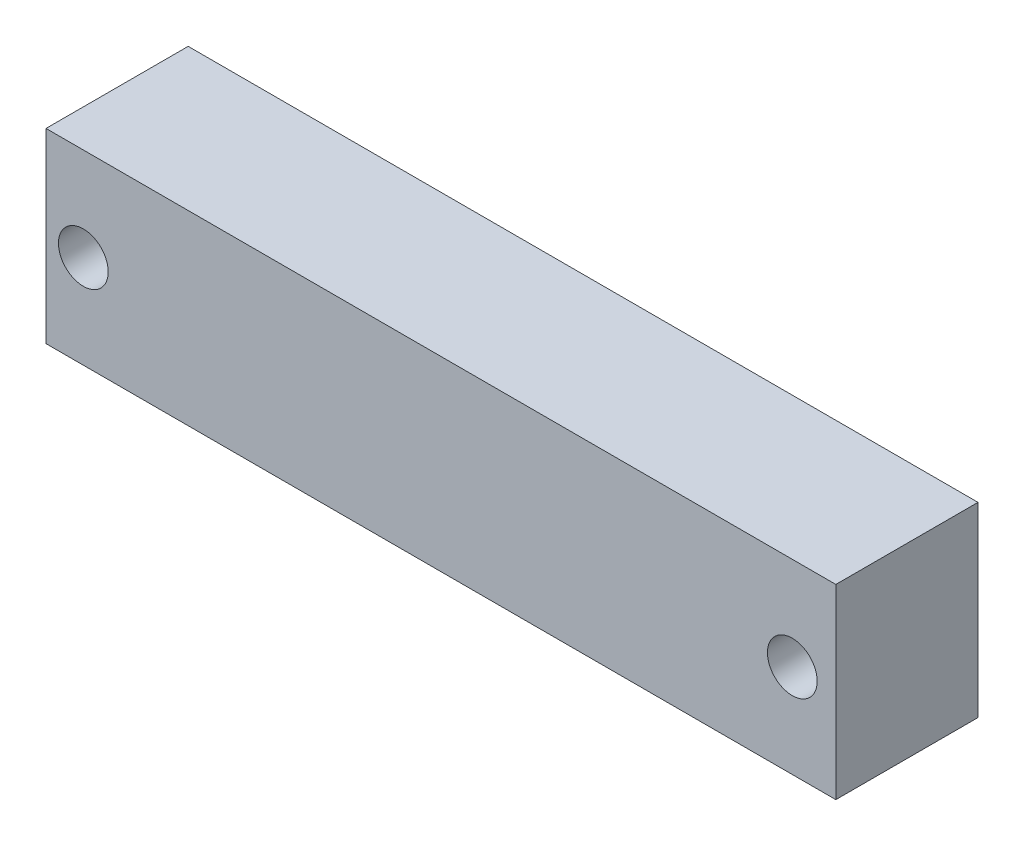
ISO-10303-21;
HEADER;
FILE_DESCRIPTION(('STEP AP214'),'2;1');
FILE_NAME('part.step','',(''),(''),'','','');
FILE_SCHEMA(('AUTOMOTIVE_DESIGN { 1 0 10303 214 1 1 1 1 }'));
ENDSEC;
DATA;
#1=APPLICATION_CONTEXT('core data for automotive mechanical design processes');
#2=APPLICATION_PROTOCOL_DEFINITION('international standard','automotive_design',2000,#1);
#3=PRODUCT_CONTEXT('',#1,'mechanical');
#4=PRODUCT('Part','Part','',(#3));
#5=PRODUCT_RELATED_PRODUCT_CATEGORY('part','',(#4));
#6=PRODUCT_DEFINITION_FORMATION('','',#4);
#7=PRODUCT_DEFINITION_CONTEXT('part definition',#1,'design');
#8=PRODUCT_DEFINITION('design','',#6,#7);
#9=PRODUCT_DEFINITION_SHAPE('','',#8);
#10=(LENGTH_UNIT() NAMED_UNIT(*) SI_UNIT(.MILLI.,.METRE.));
#11=(NAMED_UNIT(*) PLANE_ANGLE_UNIT() SI_UNIT($,.RADIAN.));
#12=(NAMED_UNIT(*) SI_UNIT($,.STERADIAN.) SOLID_ANGLE_UNIT());
#13=UNCERTAINTY_MEASURE_WITH_UNIT(LENGTH_MEASURE(1.E-05),#10,'distance_accuracy_value','');
#14=(GEOMETRIC_REPRESENTATION_CONTEXT(3) GLOBAL_UNCERTAINTY_ASSIGNED_CONTEXT((#13)) GLOBAL_UNIT_ASSIGNED_CONTEXT((#10,
#11,#12)) REPRESENTATION_CONTEXT('',''));
#15=CARTESIAN_POINT('',(0.,0.,0.));
#16=DIRECTION('',(0.,0.,1.));
#17=DIRECTION('',(1.,0.,0.));
#18=AXIS2_PLACEMENT_3D('',#15,#16,#17);
#19=CARTESIAN_POINT('',(-83.9446893787576,-21.2993987975952,11.43));
#20=DIRECTION('',(0.,1.,0.));
#21=DIRECTION('',(0.,0.,1.));
#22=AXIS2_PLACEMENT_3D('',#19,#20,#21);
#23=PLANE('',#22);
#24=DIRECTION('',(1.,0.,0.));
#25=VECTOR('',#24,1.);
#26=CARTESIAN_POINT('',(-83.9446893787576,-21.2993987975952,0.));
#27=LINE('',#26,#25);
#28=CARTESIAN_POINT('',(-83.9446893787576,-21.2993987975952,0.));
#29=VERTEX_POINT('',#28);
#30=CARTESIAN_POINT('',(-20.4446893787575,-21.2993987975952,0.));
#31=VERTEX_POINT('',#30);
#32=EDGE_CURVE('E115',#29,#31,#27,.T.);
#33=ORIENTED_EDGE('',*,*,#32,.T.);
#34=DIRECTION('',(0.,0.,-1.));
#35=VECTOR('',#34,1.);
#36=CARTESIAN_POINT('',(-20.4446893787575,-21.2993987975952,11.43));
#37=LINE('',#36,#35);
#38=CARTESIAN_POINT('',(-20.4446893787575,-21.2993987975952,11.43));
#39=VERTEX_POINT('',#38);
#40=EDGE_CURVE('E11',#39,#31,#37,.T.);
#41=ORIENTED_EDGE('',*,*,#40,.F.);
#42=DIRECTION('',(1.,0.,0.));
#43=VECTOR('',#42,1.);
#44=CARTESIAN_POINT('',(-83.9446893787576,-21.2993987975952,11.43));
#45=LINE('',#44,#43);
#46=CARTESIAN_POINT('',(-83.9446893787576,-21.2993987975952,11.43));
#47=VERTEX_POINT('',#46);
#48=EDGE_CURVE('E87',#47,#39,#45,.T.);
#49=ORIENTED_EDGE('',*,*,#48,.F.);
#50=DIRECTION('',(0.,0.,-1.));
#51=VECTOR('',#50,1.);
#52=CARTESIAN_POINT('',(-83.9446893787576,-21.2993987975952,11.43));
#53=LINE('',#52,#51);
#54=EDGE_CURVE('E111',#47,#29,#53,.T.);
#55=ORIENTED_EDGE('',*,*,#54,.T.);
#56=EDGE_LOOP('',(#33,#41,#49,#55));
#57=FACE_BOUND('',#56,.T.);
#58=ADVANCED_FACE('F45',(#57),#23,.F.);
#59=CARTESIAN_POINT('',(-20.4446893787576,-6.3133987975952,11.43));
#60=DIRECTION('',(1.,0.,0.));
#61=DIRECTION('',(0.,1.,0.));
#62=AXIS2_PLACEMENT_3D('',#59,#60,#61);
#63=PLANE('',#62);
#64=DIRECTION('',(0.,-1.,0.));
#65=VECTOR('',#64,1.);
#66=CARTESIAN_POINT('',(-20.4446893787576,-6.3133987975952,0.));
#67=LINE('',#66,#65);
#68=CARTESIAN_POINT('',(-20.4446893787576,-6.3133987975952,0.));
#69=VERTEX_POINT('',#68);
#70=EDGE_CURVE('E96',#69,#31,#67,.T.);
#71=ORIENTED_EDGE('',*,*,#70,.F.);
#72=DIRECTION('',(0.,0.,-1.));
#73=VECTOR('',#72,1.);
#74=CARTESIAN_POINT('',(-20.4446893787576,-6.3133987975952,11.43));
#75=LINE('',#74,#73);
#76=CARTESIAN_POINT('',(-20.4446893787576,-6.3133987975952,11.43));
#77=VERTEX_POINT('',#76);
#78=EDGE_CURVE('E55',#77,#69,#75,.T.);
#79=ORIENTED_EDGE('',*,*,#78,.F.);
#80=DIRECTION('',(0.,-1.,0.));
#81=VECTOR('',#80,1.);
#82=CARTESIAN_POINT('',(-20.4446893787576,-6.3133987975952,11.43));
#83=LINE('',#82,#81);
#84=EDGE_CURVE('E94',#77,#39,#83,.T.);
#85=ORIENTED_EDGE('',*,*,#84,.T.);
#86=ORIENTED_EDGE('',*,*,#40,.T.);
#87=EDGE_LOOP('',(#71,#79,#85,#86));
#88=FACE_BOUND('',#87,.T.);
#89=ADVANCED_FACE('F93',(#88),#63,.T.);
#90=CARTESIAN_POINT('',(-83.9446893787576,-6.3133987975952,11.43));
#91=DIRECTION('',(0.,1.,0.));
#92=DIRECTION('',(0.,0.,1.));
#93=AXIS2_PLACEMENT_3D('',#90,#91,#92);
#94=PLANE('',#93);
#95=DIRECTION('',(1.,0.,0.));
#96=VECTOR('',#95,1.);
#97=CARTESIAN_POINT('',(-83.9446893787576,-6.3133987975952,0.));
#98=LINE('',#97,#96);
#99=CARTESIAN_POINT('',(-83.9446893787576,-6.3133987975952,0.));
#100=VERTEX_POINT('',#99);
#101=EDGE_CURVE('E121',#100,#69,#98,.T.);
#102=ORIENTED_EDGE('',*,*,#101,.F.);
#103=DIRECTION('',(0.,0.,-1.));
#104=VECTOR('',#103,1.);
#105=CARTESIAN_POINT('',(-83.9446893787576,-6.3133987975952,11.43));
#106=LINE('',#105,#104);
#107=CARTESIAN_POINT('',(-83.9446893787576,-6.3133987975952,11.43));
#108=VERTEX_POINT('',#107);
#109=EDGE_CURVE('E79',#108,#100,#106,.T.);
#110=ORIENTED_EDGE('',*,*,#109,.F.);
#111=DIRECTION('',(1.,0.,0.));
#112=VECTOR('',#111,1.);
#113=CARTESIAN_POINT('',(-83.9446893787576,-6.3133987975952,11.43));
#114=LINE('',#113,#112);
#115=EDGE_CURVE('E104',#108,#77,#114,.T.);
#116=ORIENTED_EDGE('',*,*,#115,.T.);
#117=ORIENTED_EDGE('',*,*,#78,.T.);
#118=EDGE_LOOP('',(#102,#110,#116,#117));
#119=FACE_BOUND('',#118,.T.);
#120=ADVANCED_FACE('F107',(#119),#94,.T.);
#121=CARTESIAN_POINT('',(-83.9446893787576,-6.3133987975952,11.43));
#122=DIRECTION('',(1.,0.,0.));
#123=DIRECTION('',(0.,0.,-1.));
#124=AXIS2_PLACEMENT_3D('',#121,#122,#123);
#125=PLANE('',#124);
#126=DIRECTION('',(0.,-1.,0.));
#127=VECTOR('',#126,1.);
#128=CARTESIAN_POINT('',(-83.9446893787576,-6.3133987975952,0.));
#129=LINE('',#128,#127);
#130=EDGE_CURVE('E82',#100,#29,#129,.T.);
#131=ORIENTED_EDGE('',*,*,#130,.T.);
#132=ORIENTED_EDGE('',*,*,#54,.F.);
#133=DIRECTION('',(0.,-1.,0.));
#134=VECTOR('',#133,1.);
#135=CARTESIAN_POINT('',(-83.9446893787576,-6.3133987975952,11.43));
#136=LINE('',#135,#134);
#137=EDGE_CURVE('E64',#108,#47,#136,.T.);
#138=ORIENTED_EDGE('',*,*,#137,.F.);
#139=ORIENTED_EDGE('',*,*,#109,.T.);
#140=EDGE_LOOP('',(#131,#132,#138,#139));
#141=FACE_BOUND('',#140,.T.);
#142=ADVANCED_FACE('F153',(#141),#125,.F.);
#143=CARTESIAN_POINT('',(0.,0.,11.43));
#144=DIRECTION('',(0.,0.,-1.));
#145=DIRECTION('',(-1.,0.,0.));
#146=AXIS2_PLACEMENT_3D('',#143,#144,#145);
#147=PLANE('',#146);
#148=CARTESIAN_POINT('',(-80.9446893787576,-13.8063987975952,11.43));
#149=DIRECTION('',(0.,0.,1.));
#150=DIRECTION('',(1.,0.,0.));
#151=AXIS2_PLACEMENT_3D('',#148,#149,#150);
#152=CIRCLE('',#151,2.);
#153=CARTESIAN_POINT('',(-78.9446893787575,-13.8063987975952,11.43));
#154=VERTEX_POINT('',#153);
#155=EDGE_CURVE('E132',#154,#154,#152,.T.);
#156=ORIENTED_EDGE('',*,*,#155,.F.);
#157=EDGE_LOOP('',(#156));
#158=FACE_BOUND('',#157,.T.);
#159=CARTESIAN_POINT('',(-23.9446893787576,-13.8063987975952,11.43));
#160=DIRECTION('',(0.,0.,1.));
#161=DIRECTION('',(1.,0.,0.));
#162=AXIS2_PLACEMENT_3D('',#159,#160,#161);
#163=CIRCLE('',#162,2.);
#164=CARTESIAN_POINT('',(-21.9446893787576,-13.8063987975952,11.43));
#165=VERTEX_POINT('',#164);
#166=EDGE_CURVE('E139',#165,#165,#163,.T.);
#167=ORIENTED_EDGE('',*,*,#166,.F.);
#168=EDGE_LOOP('',(#167));
#169=FACE_BOUND('',#168,.T.);
#170=ORIENTED_EDGE('',*,*,#48,.T.);
#171=ORIENTED_EDGE('',*,*,#84,.F.);
#172=ORIENTED_EDGE('',*,*,#115,.F.);
#173=ORIENTED_EDGE('',*,*,#137,.T.);
#174=EDGE_LOOP('',(#170,#171,#172,#173));
#175=FACE_BOUND('',#174,.T.);
#176=ADVANCED_FACE('F103',(#158,#169,#175),#147,.F.);
#177=CARTESIAN_POINT('',(0.,0.,0.));
#178=DIRECTION('',(0.,0.,-1.));
#179=DIRECTION('',(-1.,0.,0.));
#180=AXIS2_PLACEMENT_3D('',#177,#178,#179);
#181=PLANE('',#180);
#182=CARTESIAN_POINT('',(-80.9446893787576,-13.8063987975952,0.));
#183=DIRECTION('',(0.,0.,-1.));
#184=DIRECTION('',(-1.,0.,0.));
#185=AXIS2_PLACEMENT_3D('',#182,#183,#184);
#186=CIRCLE('',#185,2.);
#187=CARTESIAN_POINT('',(-82.9446893787576,-13.8063987975952,0.));
#188=VERTEX_POINT('',#187);
#189=EDGE_CURVE('E48',#188,#188,#186,.T.);
#190=ORIENTED_EDGE('',*,*,#189,.F.);
#191=EDGE_LOOP('',(#190));
#192=FACE_BOUND('',#191,.T.);
#193=CARTESIAN_POINT('',(-23.9446893787576,-13.8063987975952,0.));
#194=DIRECTION('',(0.,0.,-1.));
#195=DIRECTION('',(-1.,0.,0.));
#196=AXIS2_PLACEMENT_3D('',#193,#194,#195);
#197=CIRCLE('',#196,2.);
#198=CARTESIAN_POINT('',(-25.9446893787576,-13.8063987975952,0.));
#199=VERTEX_POINT('',#198);
#200=EDGE_CURVE('E129',#199,#199,#197,.T.);
#201=ORIENTED_EDGE('',*,*,#200,.F.);
#202=EDGE_LOOP('',(#201));
#203=FACE_BOUND('',#202,.T.);
#204=ORIENTED_EDGE('',*,*,#32,.F.);
#205=ORIENTED_EDGE('',*,*,#130,.F.);
#206=ORIENTED_EDGE('',*,*,#101,.T.);
#207=ORIENTED_EDGE('',*,*,#70,.T.);
#208=EDGE_LOOP('',(#204,#205,#206,#207));
#209=FACE_BOUND('',#208,.T.);
#210=ADVANCED_FACE('F152',(#192,#203,#209),#181,.T.);
#211=CARTESIAN_POINT('',(-23.9446893787576,-13.8063987975952,-8.57));
#212=DIRECTION('',(0.,0.,1.));
#213=DIRECTION('',(1.,0.,0.));
#214=AXIS2_PLACEMENT_3D('',#211,#212,#213);
#215=CYLINDRICAL_SURFACE('',#214,2.);
#216=ORIENTED_EDGE('',*,*,#200,.T.);
#217=EDGE_LOOP('',(#216));
#218=FACE_BOUND('',#217,.T.);
#219=ORIENTED_EDGE('',*,*,#166,.T.);
#220=EDGE_LOOP('',(#219));
#221=FACE_BOUND('',#220,.T.);
#222=ADVANCED_FACE('F149',(#218,#221),#215,.F.);
#223=CARTESIAN_POINT('',(-80.9446893787576,-13.8063987975952,-8.57));
#224=DIRECTION('',(0.,0.,1.));
#225=DIRECTION('',(1.,0.,0.));
#226=AXIS2_PLACEMENT_3D('',#223,#224,#225);
#227=CYLINDRICAL_SURFACE('',#226,2.);
#228=ORIENTED_EDGE('',*,*,#189,.T.);
#229=EDGE_LOOP('',(#228));
#230=FACE_BOUND('',#229,.T.);
#231=ORIENTED_EDGE('',*,*,#155,.T.);
#232=EDGE_LOOP('',(#231));
#233=FACE_BOUND('',#232,.T.);
#234=ADVANCED_FACE('F202',(#230,#233),#227,.F.);
#235=CLOSED_SHELL('',(#58,#89,#120,#142,#176,#210,#222,#234));
#236=MANIFOLD_SOLID_BREP('B2',#235);
#237=ADVANCED_BREP_SHAPE_REPRESENTATION('',(#18,#236),#14);
#238=SHAPE_DEFINITION_REPRESENTATION(#9,#237);
ENDSEC;
END-ISO-10303-21;
